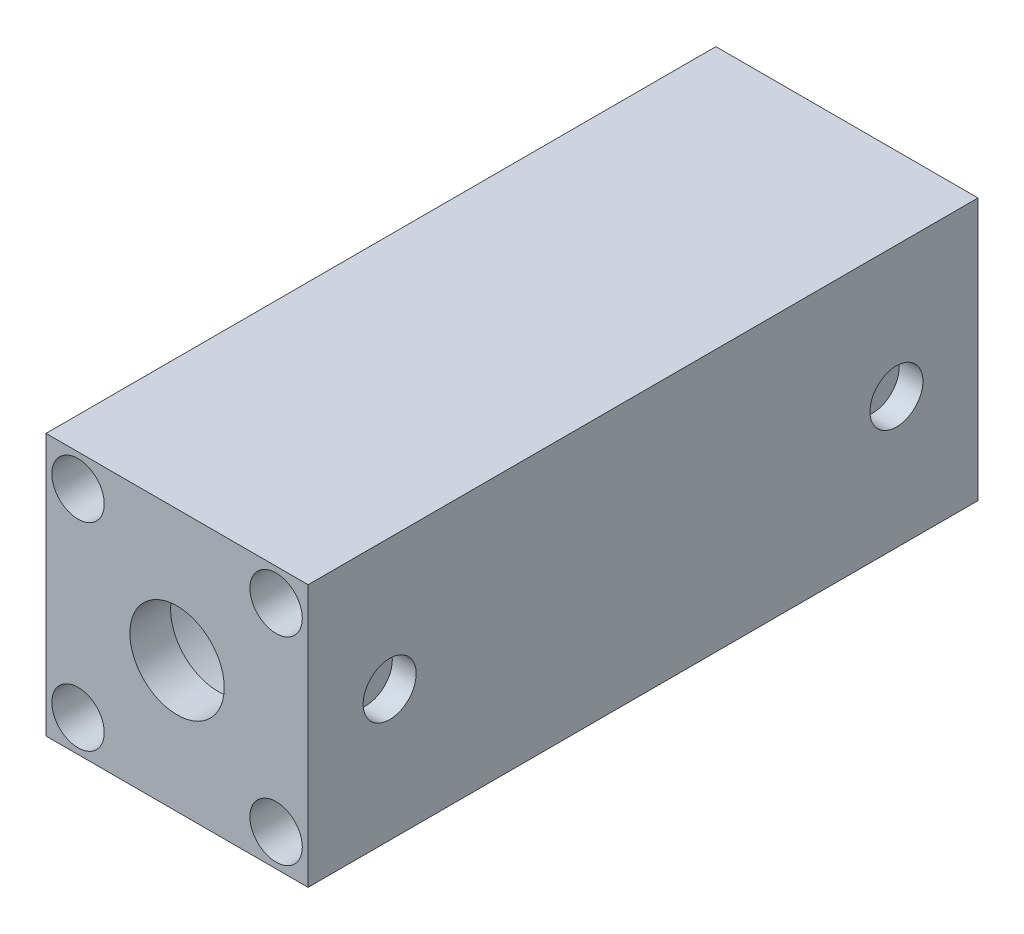
ISO-10303-21;
HEADER;
FILE_DESCRIPTION(('STEP AP214'),'2;1');
FILE_NAME('part.step','',(''),(''),'','','');
FILE_SCHEMA(('AUTOMOTIVE_DESIGN { 1 0 10303 214 1 1 1 1 }'));
ENDSEC;
DATA;
#1=APPLICATION_CONTEXT('core data for automotive mechanical design processes');
#2=APPLICATION_PROTOCOL_DEFINITION('international standard','automotive_design',2000,#1);
#3=PRODUCT_CONTEXT('',#1,'mechanical');
#4=PRODUCT('Part','Part','',(#3));
#5=PRODUCT_RELATED_PRODUCT_CATEGORY('part','',(#4));
#6=PRODUCT_DEFINITION_FORMATION('','',#4);
#7=PRODUCT_DEFINITION_CONTEXT('part definition',#1,'design');
#8=PRODUCT_DEFINITION('design','',#6,#7);
#9=PRODUCT_DEFINITION_SHAPE('','',#8);
#10=(LENGTH_UNIT() NAMED_UNIT(*) SI_UNIT(.MILLI.,.METRE.));
#11=(NAMED_UNIT(*) PLANE_ANGLE_UNIT() SI_UNIT($,.RADIAN.));
#12=(NAMED_UNIT(*) SI_UNIT($,.STERADIAN.) SOLID_ANGLE_UNIT());
#13=UNCERTAINTY_MEASURE_WITH_UNIT(LENGTH_MEASURE(1.E-05),#10,'distance_accuracy_value','');
#14=(GEOMETRIC_REPRESENTATION_CONTEXT(3) GLOBAL_UNCERTAINTY_ASSIGNED_CONTEXT((#13)) GLOBAL_UNIT_ASSIGNED_CONTEXT((#10,
#11,#12)) REPRESENTATION_CONTEXT('',''));
#15=CARTESIAN_POINT('',(0.,0.,0.));
#16=DIRECTION('',(0.,0.,1.));
#17=DIRECTION('',(1.,0.,0.));
#18=AXIS2_PLACEMENT_3D('',#15,#16,#17);
#19=CARTESIAN_POINT('',(-17.,-17.,115.));
#20=DIRECTION('',(0.,0.,-1.));
#21=DIRECTION('',(-1.,0.,0.));
#22=AXIS2_PLACEMENT_3D('',#19,#20,#21);
#23=CYLINDRICAL_SURFACE('',#22,2.75);
#24=CARTESIAN_POINT('',(-17.,-17.,7.00000000000001));
#25=DIRECTION('',(0.,0.,1.));
#26=DIRECTION('',(1.,0.,0.));
#27=AXIS2_PLACEMENT_3D('',#24,#25,#26);
#28=CIRCLE('',#27,2.75);
#29=CARTESIAN_POINT('',(-14.25,-17.,7.00000000000001));
#30=VERTEX_POINT('',#29);
#31=EDGE_CURVE('E133',#30,#30,#28,.T.);
#32=ORIENTED_EDGE('',*,*,#31,.F.);
#33=EDGE_LOOP('',(#32));
#34=FACE_BOUND('',#33,.T.);
#35=CARTESIAN_POINT('',(-17.,-17.,108.));
#36=DIRECTION('',(0.,0.,1.));
#37=DIRECTION('',(1.,0.,0.));
#38=AXIS2_PLACEMENT_3D('',#35,#36,#37);
#39=CIRCLE('',#38,2.75);
#40=CARTESIAN_POINT('',(-14.25,-17.,108.));
#41=VERTEX_POINT('',#40);
#42=EDGE_CURVE('E44',#41,#41,#39,.T.);
#43=ORIENTED_EDGE('',*,*,#42,.T.);
#44=EDGE_LOOP('',(#43));
#45=FACE_BOUND('',#44,.T.);
#46=ADVANCED_FACE('F41',(#34,#45),#23,.F.);
#47=CARTESIAN_POINT('',(-17.,17.,115.));
#48=DIRECTION('',(0.,0.,-1.));
#49=DIRECTION('',(-1.,0.,0.));
#50=AXIS2_PLACEMENT_3D('',#47,#48,#49);
#51=CYLINDRICAL_SURFACE('',#50,2.75);
#52=CARTESIAN_POINT('',(-17.,17.,7.00000000000001));
#53=DIRECTION('',(0.,0.,1.));
#54=DIRECTION('',(1.,0.,0.));
#55=AXIS2_PLACEMENT_3D('',#52,#53,#54);
#56=CIRCLE('',#55,2.75);
#57=CARTESIAN_POINT('',(-14.25,17.,7.00000000000001));
#58=VERTEX_POINT('',#57);
#59=EDGE_CURVE('E126',#58,#58,#56,.T.);
#60=ORIENTED_EDGE('',*,*,#59,.F.);
#61=EDGE_LOOP('',(#60));
#62=FACE_BOUND('',#61,.T.);
#63=CARTESIAN_POINT('',(-17.,17.,108.));
#64=DIRECTION('',(0.,0.,1.));
#65=DIRECTION('',(1.,0.,0.));
#66=AXIS2_PLACEMENT_3D('',#63,#64,#65);
#67=CIRCLE('',#66,2.75);
#68=CARTESIAN_POINT('',(-14.25,17.,108.));
#69=VERTEX_POINT('',#68);
#70=EDGE_CURVE('E143',#69,#69,#67,.T.);
#71=ORIENTED_EDGE('',*,*,#70,.T.);
#72=EDGE_LOOP('',(#71));
#73=FACE_BOUND('',#72,.T.);
#74=ADVANCED_FACE('F202',(#62,#73),#51,.F.);
#75=CARTESIAN_POINT('',(17.,-17.,115.));
#76=DIRECTION('',(0.,0.,-1.));
#77=DIRECTION('',(-1.,0.,0.));
#78=AXIS2_PLACEMENT_3D('',#75,#76,#77);
#79=CYLINDRICAL_SURFACE('',#78,2.75);
#80=CARTESIAN_POINT('',(17.,-17.,7.00000000000001));
#81=DIRECTION('',(0.,0.,1.));
#82=DIRECTION('',(1.,0.,0.));
#83=AXIS2_PLACEMENT_3D('',#80,#81,#82);
#84=CIRCLE('',#83,2.75);
#85=CARTESIAN_POINT('',(19.75,-17.,7.00000000000001));
#86=VERTEX_POINT('',#85);
#87=EDGE_CURVE('E123',#86,#86,#84,.T.);
#88=ORIENTED_EDGE('',*,*,#87,.F.);
#89=EDGE_LOOP('',(#88));
#90=FACE_BOUND('',#89,.T.);
#91=CARTESIAN_POINT('',(17.,-17.,108.));
#92=DIRECTION('',(0.,0.,1.));
#93=DIRECTION('',(1.,0.,0.));
#94=AXIS2_PLACEMENT_3D('',#91,#92,#93);
#95=CIRCLE('',#94,2.75);
#96=CARTESIAN_POINT('',(19.75,-17.,108.));
#97=VERTEX_POINT('',#96);
#98=EDGE_CURVE('E137',#97,#97,#95,.T.);
#99=ORIENTED_EDGE('',*,*,#98,.T.);
#100=EDGE_LOOP('',(#99));
#101=FACE_BOUND('',#100,.T.);
#102=ADVANCED_FACE('F215',(#90,#101),#79,.F.);
#103=CARTESIAN_POINT('',(17.,17.,115.));
#104=DIRECTION('',(0.,0.,-1.));
#105=DIRECTION('',(-1.,0.,0.));
#106=AXIS2_PLACEMENT_3D('',#103,#104,#105);
#107=CYLINDRICAL_SURFACE('',#106,2.75);
#108=CARTESIAN_POINT('',(17.,17.,7.00000000000001));
#109=DIRECTION('',(0.,0.,1.));
#110=DIRECTION('',(1.,0.,0.));
#111=AXIS2_PLACEMENT_3D('',#108,#109,#110);
#112=CIRCLE('',#111,2.75);
#113=CARTESIAN_POINT('',(19.75,17.,7.00000000000001));
#114=VERTEX_POINT('',#113);
#115=EDGE_CURVE('E121',#114,#114,#112,.T.);
#116=ORIENTED_EDGE('',*,*,#115,.F.);
#117=EDGE_LOOP('',(#116));
#118=FACE_BOUND('',#117,.T.);
#119=CARTESIAN_POINT('',(17.,17.,108.));
#120=DIRECTION('',(0.,0.,1.));
#121=DIRECTION('',(1.,0.,0.));
#122=AXIS2_PLACEMENT_3D('',#119,#120,#121);
#123=CIRCLE('',#122,2.75);
#124=CARTESIAN_POINT('',(19.75,17.,108.));
#125=VERTEX_POINT('',#124);
#126=EDGE_CURVE('E131',#125,#125,#123,.T.);
#127=ORIENTED_EDGE('',*,*,#126,.T.);
#128=EDGE_LOOP('',(#127));
#129=FACE_BOUND('',#128,.T.);
#130=ADVANCED_FACE('F222',(#118,#129),#107,.F.);
#131=CARTESIAN_POINT('',(0.,0.,115.));
#132=DIRECTION('',(0.,0.,1.));
#133=DIRECTION('',(1.,0.,0.));
#134=AXIS2_PLACEMENT_3D('',#131,#132,#133);
#135=PLANE('',#134);
#136=CARTESIAN_POINT('',(-17.,17.,115.));
#137=DIRECTION('',(0.,0.,1.));
#138=DIRECTION('',(1.,0.,0.));
#139=AXIS2_PLACEMENT_3D('',#136,#137,#138);
#140=CIRCLE('',#139,4.5);
#141=CARTESIAN_POINT('',(-12.5,17.,115.));
#142=VERTEX_POINT('',#141);
#143=EDGE_CURVE('E542',#142,#142,#140,.T.);
#144=ORIENTED_EDGE('',*,*,#143,.F.);
#145=EDGE_LOOP('',(#144));
#146=FACE_BOUND('',#145,.T.);
#147=CARTESIAN_POINT('',(17.,-17.,115.));
#148=DIRECTION('',(0.,0.,1.));
#149=DIRECTION('',(1.,0.,0.));
#150=AXIS2_PLACEMENT_3D('',#147,#148,#149);
#151=CIRCLE('',#150,4.5);
#152=CARTESIAN_POINT('',(21.5,-17.,115.));
#153=VERTEX_POINT('',#152);
#154=EDGE_CURVE('E538',#153,#153,#151,.T.);
#155=ORIENTED_EDGE('',*,*,#154,.F.);
#156=EDGE_LOOP('',(#155));
#157=FACE_BOUND('',#156,.T.);
#158=CARTESIAN_POINT('',(17.,17.,115.));
#159=DIRECTION('',(0.,0.,1.));
#160=DIRECTION('',(1.,0.,0.));
#161=AXIS2_PLACEMENT_3D('',#158,#159,#160);
#162=CIRCLE('',#161,4.5);
#163=CARTESIAN_POINT('',(21.5,17.,115.));
#164=VERTEX_POINT('',#163);
#165=EDGE_CURVE('E525',#164,#164,#162,.T.);
#166=ORIENTED_EDGE('',*,*,#165,.F.);
#167=EDGE_LOOP('',(#166));
#168=FACE_BOUND('',#167,.T.);
#169=CARTESIAN_POINT('',(-17.,-17.,115.));
#170=DIRECTION('',(0.,0.,1.));
#171=DIRECTION('',(1.,0.,0.));
#172=AXIS2_PLACEMENT_3D('',#169,#170,#171);
#173=CIRCLE('',#172,4.5);
#174=CARTESIAN_POINT('',(-12.5,-17.,115.));
#175=VERTEX_POINT('',#174);
#176=EDGE_CURVE('E138',#175,#175,#173,.T.);
#177=ORIENTED_EDGE('',*,*,#176,.F.);
#178=EDGE_LOOP('',(#177));
#179=FACE_BOUND('',#178,.T.);
#180=DIRECTION('',(0.,-1.,0.));
#181=VECTOR('',#180,1.);
#182=CARTESIAN_POINT('',(-22.5,22.5,115.));
#183=LINE('',#182,#181);
#184=CARTESIAN_POINT('',(-22.5,22.5,115.));
#185=VERTEX_POINT('',#184);
#186=CARTESIAN_POINT('',(-22.5,-22.5,115.));
#187=VERTEX_POINT('',#186);
#188=EDGE_CURVE('E100',#185,#187,#183,.T.);
#189=ORIENTED_EDGE('',*,*,#188,.T.);
#190=DIRECTION('',(1.,0.,0.));
#191=VECTOR('',#190,1.);
#192=CARTESIAN_POINT('',(-22.5,-22.5,115.));
#193=LINE('',#192,#191);
#194=CARTESIAN_POINT('',(22.5,-22.5,115.));
#195=VERTEX_POINT('',#194);
#196=EDGE_CURVE('E93',#187,#195,#193,.T.);
#197=ORIENTED_EDGE('',*,*,#196,.T.);
#198=DIRECTION('',(0.,1.,0.));
#199=VECTOR('',#198,1.);
#200=CARTESIAN_POINT('',(22.5,-22.5,115.));
#201=LINE('',#200,#199);
#202=CARTESIAN_POINT('',(22.5,22.5,115.));
#203=VERTEX_POINT('',#202);
#204=EDGE_CURVE('E92',#195,#203,#201,.T.);
#205=ORIENTED_EDGE('',*,*,#204,.T.);
#206=DIRECTION('',(-1.,0.,0.));
#207=VECTOR('',#206,1.);
#208=CARTESIAN_POINT('',(22.5,22.5,115.));
#209=LINE('',#208,#207);
#210=EDGE_CURVE('E58',#203,#185,#209,.T.);
#211=ORIENTED_EDGE('',*,*,#210,.T.);
#212=EDGE_LOOP('',(#189,#197,#205,#211));
#213=FACE_BOUND('',#212,.T.);
#214=CARTESIAN_POINT('',(0.,0.,115.));
#215=DIRECTION('',(0.,0.,1.));
#216=DIRECTION('',(1.,0.,0.));
#217=AXIS2_PLACEMENT_3D('',#214,#215,#216);
#218=CIRCLE('',#217,8.1);
#219=CARTESIAN_POINT('',(8.1,0.,115.));
#220=VERTEX_POINT('',#219);
#221=EDGE_CURVE('E171',#220,#220,#218,.T.);
#222=ORIENTED_EDGE('',*,*,#221,.F.);
#223=EDGE_LOOP('',(#222));
#224=FACE_BOUND('',#223,.T.);
#225=ADVANCED_FACE('F95',(#146,#157,#168,#179,#213,#224),#135,.T.);
#226=CARTESIAN_POINT('',(0.,0.,0.));
#227=DIRECTION('',(0.,0.,1.));
#228=DIRECTION('',(1.,0.,0.));
#229=AXIS2_PLACEMENT_3D('',#226,#227,#228);
#230=PLANE('',#229);
#231=CARTESIAN_POINT('',(-17.,17.,0.));
#232=DIRECTION('',(0.,0.,1.));
#233=DIRECTION('',(1.,0.,0.));
#234=AXIS2_PLACEMENT_3D('',#231,#232,#233);
#235=CIRCLE('',#234,4.5);
#236=CARTESIAN_POINT('',(-12.5,17.,0.));
#237=VERTEX_POINT('',#236);
#238=EDGE_CURVE('E157',#237,#237,#235,.T.);
#239=ORIENTED_EDGE('',*,*,#238,.T.);
#240=EDGE_LOOP('',(#239));
#241=FACE_BOUND('',#240,.T.);
#242=CARTESIAN_POINT('',(17.,-17.,0.));
#243=DIRECTION('',(0.,0.,1.));
#244=DIRECTION('',(1.,0.,0.));
#245=AXIS2_PLACEMENT_3D('',#242,#243,#244);
#246=CIRCLE('',#245,4.5);
#247=CARTESIAN_POINT('',(21.5,-17.,0.));
#248=VERTEX_POINT('',#247);
#249=EDGE_CURVE('E167',#248,#248,#246,.T.);
#250=ORIENTED_EDGE('',*,*,#249,.T.);
#251=EDGE_LOOP('',(#250));
#252=FACE_BOUND('',#251,.T.);
#253=CARTESIAN_POINT('',(17.,17.,0.));
#254=DIRECTION('',(0.,0.,1.));
#255=DIRECTION('',(1.,0.,0.));
#256=AXIS2_PLACEMENT_3D('',#253,#254,#255);
#257=CIRCLE('',#256,4.5);
#258=CARTESIAN_POINT('',(21.5,17.,0.));
#259=VERTEX_POINT('',#258);
#260=EDGE_CURVE('E147',#259,#259,#257,.T.);
#261=ORIENTED_EDGE('',*,*,#260,.T.);
#262=EDGE_LOOP('',(#261));
#263=FACE_BOUND('',#262,.T.);
#264=CARTESIAN_POINT('',(-17.,-17.,0.));
#265=DIRECTION('',(0.,0.,1.));
#266=DIRECTION('',(1.,0.,0.));
#267=AXIS2_PLACEMENT_3D('',#264,#265,#266);
#268=CIRCLE('',#267,4.5);
#269=CARTESIAN_POINT('',(-12.5,-17.,0.));
#270=VERTEX_POINT('',#269);
#271=EDGE_CURVE('E165',#270,#270,#268,.T.);
#272=ORIENTED_EDGE('',*,*,#271,.T.);
#273=EDGE_LOOP('',(#272));
#274=FACE_BOUND('',#273,.T.);
#275=DIRECTION('',(0.,-1.,0.));
#276=VECTOR('',#275,1.);
#277=CARTESIAN_POINT('',(-22.5,22.5,0.));
#278=LINE('',#277,#276);
#279=CARTESIAN_POINT('',(-22.5,22.5,0.));
#280=VERTEX_POINT('',#279);
#281=CARTESIAN_POINT('',(-22.5,-22.5,0.));
#282=VERTEX_POINT('',#281);
#283=EDGE_CURVE('E112',#280,#282,#278,.T.);
#284=ORIENTED_EDGE('',*,*,#283,.F.);
#285=DIRECTION('',(-1.,0.,0.));
#286=VECTOR('',#285,1.);
#287=CARTESIAN_POINT('',(22.5,22.5,0.));
#288=LINE('',#287,#286);
#289=CARTESIAN_POINT('',(22.5,22.5,0.));
#290=VERTEX_POINT('',#289);
#291=EDGE_CURVE('E82',#290,#280,#288,.T.);
#292=ORIENTED_EDGE('',*,*,#291,.F.);
#293=DIRECTION('',(0.,1.,0.));
#294=VECTOR('',#293,1.);
#295=CARTESIAN_POINT('',(22.5,-22.5,0.));
#296=LINE('',#295,#294);
#297=CARTESIAN_POINT('',(22.5,-22.5,0.));
#298=VERTEX_POINT('',#297);
#299=EDGE_CURVE('E79',#298,#290,#296,.T.);
#300=ORIENTED_EDGE('',*,*,#299,.F.);
#301=DIRECTION('',(1.,0.,0.));
#302=VECTOR('',#301,1.);
#303=CARTESIAN_POINT('',(-22.5,-22.5,0.));
#304=LINE('',#303,#302);
#305=EDGE_CURVE('E105',#282,#298,#304,.T.);
#306=ORIENTED_EDGE('',*,*,#305,.F.);
#307=EDGE_LOOP('',(#284,#292,#300,#306));
#308=FACE_BOUND('',#307,.T.);
#309=ADVANCED_FACE('F219',(#241,#252,#263,#274,#308),#230,.F.);
#310=CARTESIAN_POINT('',(-22.5,22.5,115.));
#311=DIRECTION('',(1.,0.,0.));
#312=DIRECTION('',(0.,0.,-1.));
#313=AXIS2_PLACEMENT_3D('',#310,#311,#312);
#314=PLANE('',#313);
#315=ORIENTED_EDGE('',*,*,#283,.T.);
#316=DIRECTION('',(0.,0.,-1.));
#317=VECTOR('',#316,1.);
#318=CARTESIAN_POINT('',(-22.5,-22.5,115.));
#319=LINE('',#318,#317);
#320=EDGE_CURVE('E51',#187,#282,#319,.T.);
#321=ORIENTED_EDGE('',*,*,#320,.F.);
#322=ORIENTED_EDGE('',*,*,#188,.F.);
#323=DIRECTION('',(0.,0.,-1.));
#324=VECTOR('',#323,1.);
#325=CARTESIAN_POINT('',(-22.5,22.5,115.));
#326=LINE('',#325,#324);
#327=EDGE_CURVE('E110',#185,#280,#326,.T.);
#328=ORIENTED_EDGE('',*,*,#327,.T.);
#329=EDGE_LOOP('',(#315,#321,#322,#328));
#330=FACE_BOUND('',#329,.T.);
#331=ADVANCED_FACE('F43',(#330),#314,.F.);
#332=CARTESIAN_POINT('',(-22.5,-22.5,115.));
#333=DIRECTION('',(0.,1.,0.));
#334=DIRECTION('',(0.,0.,1.));
#335=AXIS2_PLACEMENT_3D('',#332,#333,#334);
#336=PLANE('',#335);
#337=ORIENTED_EDGE('',*,*,#305,.T.);
#338=DIRECTION('',(0.,0.,-1.));
#339=VECTOR('',#338,1.);
#340=CARTESIAN_POINT('',(22.5,-22.5,115.));
#341=LINE('',#340,#339);
#342=EDGE_CURVE('E99',#195,#298,#341,.T.);
#343=ORIENTED_EDGE('',*,*,#342,.F.);
#344=ORIENTED_EDGE('',*,*,#196,.F.);
#345=ORIENTED_EDGE('',*,*,#320,.T.);
#346=EDGE_LOOP('',(#337,#343,#344,#345));
#347=FACE_BOUND('',#346,.T.);
#348=ADVANCED_FACE('F101',(#347),#336,.F.);
#349=CARTESIAN_POINT('',(22.5,-22.5,115.));
#350=DIRECTION('',(-1.,0.,0.));
#351=DIRECTION('',(0.,0.,1.));
#352=AXIS2_PLACEMENT_3D('',#349,#350,#351);
#353=PLANE('',#352);
#354=CARTESIAN_POINT('',(22.5,0.,14.));
#355=DIRECTION('',(1.,0.,0.));
#356=DIRECTION('',(0.,0.,-1.));
#357=AXIS2_PLACEMENT_3D('',#354,#355,#356);
#358=CIRCLE('',#357,4.55);
#359=CARTESIAN_POINT('',(22.5,0.,9.45));
#360=VERTEX_POINT('',#359);
#361=EDGE_CURVE('E522',#360,#360,#358,.T.);
#362=ORIENTED_EDGE('',*,*,#361,.F.);
#363=EDGE_LOOP('',(#362));
#364=FACE_BOUND('',#363,.T.);
#365=CARTESIAN_POINT('',(22.5,0.,101.));
#366=DIRECTION('',(1.,0.,0.));
#367=DIRECTION('',(0.,0.,-1.));
#368=AXIS2_PLACEMENT_3D('',#365,#366,#367);
#369=CIRCLE('',#368,4.55);
#370=CARTESIAN_POINT('',(22.5,0.,96.45));
#371=VERTEX_POINT('',#370);
#372=EDGE_CURVE('E530',#371,#371,#369,.T.);
#373=ORIENTED_EDGE('',*,*,#372,.F.);
#374=EDGE_LOOP('',(#373));
#375=FACE_BOUND('',#374,.T.);
#376=ORIENTED_EDGE('',*,*,#299,.T.);
#377=DIRECTION('',(0.,0.,-1.));
#378=VECTOR('',#377,1.);
#379=CARTESIAN_POINT('',(22.5,22.5,115.));
#380=LINE('',#379,#378);
#381=EDGE_CURVE('E103',#203,#290,#380,.T.);
#382=ORIENTED_EDGE('',*,*,#381,.F.);
#383=ORIENTED_EDGE('',*,*,#204,.F.);
#384=ORIENTED_EDGE('',*,*,#342,.T.);
#385=EDGE_LOOP('',(#376,#382,#383,#384));
#386=FACE_BOUND('',#385,.T.);
#387=ADVANCED_FACE('F104',(#364,#375,#386),#353,.F.);
#388=CARTESIAN_POINT('',(22.5,22.5,115.));
#389=DIRECTION('',(0.,-1.,0.));
#390=DIRECTION('',(0.,0.,-1.));
#391=AXIS2_PLACEMENT_3D('',#388,#389,#390);
#392=PLANE('',#391);
#393=ORIENTED_EDGE('',*,*,#291,.T.);
#394=ORIENTED_EDGE('',*,*,#327,.F.);
#395=ORIENTED_EDGE('',*,*,#210,.F.);
#396=ORIENTED_EDGE('',*,*,#381,.T.);
#397=EDGE_LOOP('',(#393,#394,#395,#396));
#398=FACE_BOUND('',#397,.T.);
#399=ADVANCED_FACE('F190',(#398),#392,.F.);
#400=CARTESIAN_POINT('',(0.,0.,108.));
#401=DIRECTION('',(0.,0.,1.));
#402=DIRECTION('',(1.,0.,0.));
#403=AXIS2_PLACEMENT_3D('',#400,#401,#402);
#404=PLANE('',#403);
#405=CARTESIAN_POINT('',(0.,0.,108.));
#406=DIRECTION('',(0.,0.,1.));
#407=DIRECTION('',(1.,0.,0.));
#408=AXIS2_PLACEMENT_3D('',#405,#406,#407);
#409=CIRCLE('',#408,16.);
#410=CARTESIAN_POINT('',(16.,0.,108.));
#411=VERTEX_POINT('',#410);
#412=EDGE_CURVE('E111',#411,#411,#409,.T.);
#413=ORIENTED_EDGE('',*,*,#412,.F.);
#414=EDGE_LOOP('',(#413));
#415=FACE_BOUND('',#414,.T.);
#416=CARTESIAN_POINT('',(0.,0.,108.));
#417=DIRECTION('',(0.,0.,1.));
#418=DIRECTION('',(1.,0.,0.));
#419=AXIS2_PLACEMENT_3D('',#416,#417,#418);
#420=CIRCLE('',#419,8.1);
#421=CARTESIAN_POINT('',(8.1,0.,108.));
#422=VERTEX_POINT('',#421);
#423=EDGE_CURVE('E135',#422,#422,#420,.T.);
#424=ORIENTED_EDGE('',*,*,#423,.T.);
#425=EDGE_LOOP('',(#424));
#426=FACE_BOUND('',#425,.T.);
#427=ADVANCED_FACE('F183',(#415,#426),#404,.F.);
#428=CARTESIAN_POINT('',(0.,0.,115.));
#429=DIRECTION('',(0.,0.,-1.));
#430=DIRECTION('',(-1.,0.,0.));
#431=AXIS2_PLACEMENT_3D('',#428,#429,#430);
#432=CYLINDRICAL_SURFACE('',#431,8.1);
#433=ORIENTED_EDGE('',*,*,#221,.T.);
#434=EDGE_LOOP('',(#433));
#435=FACE_BOUND('',#434,.T.);
#436=ORIENTED_EDGE('',*,*,#423,.F.);
#437=EDGE_LOOP('',(#436));
#438=FACE_BOUND('',#437,.T.);
#439=ADVANCED_FACE('F187',(#435,#438),#432,.F.);
#440=CARTESIAN_POINT('',(0.,0.,7.));
#441=DIRECTION('',(0.,0.,1.));
#442=DIRECTION('',(1.,0.,0.));
#443=AXIS2_PLACEMENT_3D('',#440,#441,#442);
#444=PLANE('',#443);
#445=CARTESIAN_POINT('',(0.,0.,7.00000000000001));
#446=DIRECTION('',(0.,0.,1.));
#447=DIRECTION('',(1.,0.,0.));
#448=AXIS2_PLACEMENT_3D('',#445,#446,#447);
#449=CIRCLE('',#448,16.);
#450=CARTESIAN_POINT('',(16.,0.,7.00000000000001));
#451=VERTEX_POINT('',#450);
#452=EDGE_CURVE('E11',#451,#451,#449,.T.);
#453=ORIENTED_EDGE('',*,*,#452,.T.);
#454=EDGE_LOOP('',(#453));
#455=FACE_BOUND('',#454,.T.);
#456=ADVANCED_FACE('F193',(#455),#444,.T.);
#457=CARTESIAN_POINT('',(0.,0.,115.));
#458=DIRECTION('',(0.,0.,-1.));
#459=DIRECTION('',(-1.,0.,0.));
#460=AXIS2_PLACEMENT_3D('',#457,#458,#459);
#461=CYLINDRICAL_SURFACE('',#460,16.);
#462=ORIENTED_EDGE('',*,*,#452,.F.);
#463=EDGE_LOOP('',(#462));
#464=FACE_BOUND('',#463,.T.);
#465=ORIENTED_EDGE('',*,*,#412,.T.);
#466=EDGE_LOOP('',(#465));
#467=FACE_BOUND('',#466,.T.);
#468=ADVANCED_FACE('F181',(#464,#467),#461,.F.);
#469=CARTESIAN_POINT('',(17.,17.,7.));
#470=DIRECTION('',(0.,0.,-1.));
#471=DIRECTION('',(-1.,0.,0.));
#472=AXIS2_PLACEMENT_3D('',#469,#470,#471);
#473=CYLINDRICAL_SURFACE('',#472,4.5);
#474=CARTESIAN_POINT('',(17.,17.,7.));
#475=DIRECTION('',(0.,0.,1.));
#476=DIRECTION('',(1.,0.,0.));
#477=AXIS2_PLACEMENT_3D('',#474,#475,#476);
#478=CIRCLE('',#477,4.5);
#479=CARTESIAN_POINT('',(21.5,17.,7.));
#480=VERTEX_POINT('',#479);
#481=EDGE_CURVE('E148',#480,#480,#478,.T.);
#482=ORIENTED_EDGE('',*,*,#481,.T.);
#483=EDGE_LOOP('',(#482));
#484=FACE_BOUND('',#483,.T.);
#485=ORIENTED_EDGE('',*,*,#260,.F.);
#486=EDGE_LOOP('',(#485));
#487=FACE_BOUND('',#486,.T.);
#488=ADVANCED_FACE('F284',(#484,#487),#473,.F.);
#489=CARTESIAN_POINT('',(17.,17.,7.));
#490=DIRECTION('',(0.,0.,1.));
#491=DIRECTION('',(1.,0.,0.));
#492=AXIS2_PLACEMENT_3D('',#489,#490,#491);
#493=PLANE('',#492);
#494=ORIENTED_EDGE('',*,*,#115,.T.);
#495=EDGE_LOOP('',(#494));
#496=FACE_BOUND('',#495,.T.);
#497=ORIENTED_EDGE('',*,*,#481,.F.);
#498=EDGE_LOOP('',(#497));
#499=FACE_BOUND('',#498,.T.);
#500=ADVANCED_FACE('F310',(#496,#499),#493,.F.);
#501=CARTESIAN_POINT('',(17.,-17.,7.));
#502=DIRECTION('',(0.,0.,-1.));
#503=DIRECTION('',(-1.,0.,0.));
#504=AXIS2_PLACEMENT_3D('',#501,#502,#503);
#505=CYLINDRICAL_SURFACE('',#504,4.5);
#506=CARTESIAN_POINT('',(17.,-17.,7.));
#507=DIRECTION('',(0.,0.,1.));
#508=DIRECTION('',(1.,0.,0.));
#509=AXIS2_PLACEMENT_3D('',#506,#507,#508);
#510=CIRCLE('',#509,4.5);
#511=CARTESIAN_POINT('',(21.5,-17.,7.));
#512=VERTEX_POINT('',#511);
#513=EDGE_CURVE('E154',#512,#512,#510,.T.);
#514=ORIENTED_EDGE('',*,*,#513,.T.);
#515=EDGE_LOOP('',(#514));
#516=FACE_BOUND('',#515,.T.);
#517=ORIENTED_EDGE('',*,*,#249,.F.);
#518=EDGE_LOOP('',(#517));
#519=FACE_BOUND('',#518,.T.);
#520=ADVANCED_FACE('F318',(#516,#519),#505,.F.);
#521=CARTESIAN_POINT('',(17.,-17.,7.));
#522=DIRECTION('',(0.,0.,1.));
#523=DIRECTION('',(1.,0.,0.));
#524=AXIS2_PLACEMENT_3D('',#521,#522,#523);
#525=PLANE('',#524);
#526=ORIENTED_EDGE('',*,*,#87,.T.);
#527=EDGE_LOOP('',(#526));
#528=FACE_BOUND('',#527,.T.);
#529=ORIENTED_EDGE('',*,*,#513,.F.);
#530=EDGE_LOOP('',(#529));
#531=FACE_BOUND('',#530,.T.);
#532=ADVANCED_FACE('F327',(#528,#531),#525,.F.);
#533=CARTESIAN_POINT('',(-17.,17.,7.));
#534=DIRECTION('',(0.,0.,-1.));
#535=DIRECTION('',(-1.,0.,0.));
#536=AXIS2_PLACEMENT_3D('',#533,#534,#535);
#537=CYLINDRICAL_SURFACE('',#536,4.5);
#538=CARTESIAN_POINT('',(-17.,17.,7.));
#539=DIRECTION('',(0.,0.,1.));
#540=DIRECTION('',(1.,0.,0.));
#541=AXIS2_PLACEMENT_3D('',#538,#539,#540);
#542=CIRCLE('',#541,4.5);
#543=CARTESIAN_POINT('',(-12.5,17.,7.));
#544=VERTEX_POINT('',#543);
#545=EDGE_CURVE('E162',#544,#544,#542,.T.);
#546=ORIENTED_EDGE('',*,*,#545,.T.);
#547=EDGE_LOOP('',(#546));
#548=FACE_BOUND('',#547,.T.);
#549=ORIENTED_EDGE('',*,*,#238,.F.);
#550=EDGE_LOOP('',(#549));
#551=FACE_BOUND('',#550,.T.);
#552=ADVANCED_FACE('F337',(#548,#551),#537,.F.);
#553=CARTESIAN_POINT('',(-17.,17.,7.));
#554=DIRECTION('',(0.,0.,1.));
#555=DIRECTION('',(1.,0.,0.));
#556=AXIS2_PLACEMENT_3D('',#553,#554,#555);
#557=PLANE('',#556);
#558=ORIENTED_EDGE('',*,*,#59,.T.);
#559=EDGE_LOOP('',(#558));
#560=FACE_BOUND('',#559,.T.);
#561=ORIENTED_EDGE('',*,*,#545,.F.);
#562=EDGE_LOOP('',(#561));
#563=FACE_BOUND('',#562,.T.);
#564=ADVANCED_FACE('F346',(#560,#563),#557,.F.);
#565=CARTESIAN_POINT('',(-17.,-17.,7.));
#566=DIRECTION('',(0.,0.,-1.));
#567=DIRECTION('',(-1.,0.,0.));
#568=AXIS2_PLACEMENT_3D('',#565,#566,#567);
#569=CYLINDRICAL_SURFACE('',#568,4.5);
#570=CARTESIAN_POINT('',(-17.,-17.,7.));
#571=DIRECTION('',(0.,0.,1.));
#572=DIRECTION('',(1.,0.,0.));
#573=AXIS2_PLACEMENT_3D('',#570,#571,#572);
#574=CIRCLE('',#573,4.5);
#575=CARTESIAN_POINT('',(-12.5,-17.,7.));
#576=VERTEX_POINT('',#575);
#577=EDGE_CURVE('E124',#576,#576,#574,.T.);
#578=ORIENTED_EDGE('',*,*,#577,.T.);
#579=EDGE_LOOP('',(#578));
#580=FACE_BOUND('',#579,.T.);
#581=ORIENTED_EDGE('',*,*,#271,.F.);
#582=EDGE_LOOP('',(#581));
#583=FACE_BOUND('',#582,.T.);
#584=ADVANCED_FACE('F357',(#580,#583),#569,.F.);
#585=CARTESIAN_POINT('',(-17.,-17.,7.));
#586=DIRECTION('',(0.,0.,1.));
#587=DIRECTION('',(1.,0.,0.));
#588=AXIS2_PLACEMENT_3D('',#585,#586,#587);
#589=PLANE('',#588);
#590=ORIENTED_EDGE('',*,*,#31,.T.);
#591=EDGE_LOOP('',(#590));
#592=FACE_BOUND('',#591,.T.);
#593=ORIENTED_EDGE('',*,*,#577,.F.);
#594=EDGE_LOOP('',(#593));
#595=FACE_BOUND('',#594,.T.);
#596=ADVANCED_FACE('F366',(#592,#595),#589,.F.);
#597=CARTESIAN_POINT('',(17.,17.,115.));
#598=DIRECTION('',(0.,0.,-1.));
#599=DIRECTION('',(-1.,0.,0.));
#600=AXIS2_PLACEMENT_3D('',#597,#598,#599);
#601=CYLINDRICAL_SURFACE('',#600,4.5);
#602=ORIENTED_EDGE('',*,*,#165,.T.);
#603=EDGE_LOOP('',(#602));
#604=FACE_BOUND('',#603,.T.);
#605=CARTESIAN_POINT('',(17.,17.,108.));
#606=DIRECTION('',(0.,0.,1.));
#607=DIRECTION('',(1.,0.,0.));
#608=AXIS2_PLACEMENT_3D('',#605,#606,#607);
#609=CIRCLE('',#608,4.5);
#610=CARTESIAN_POINT('',(21.5,17.,108.));
#611=VERTEX_POINT('',#610);
#612=EDGE_CURVE('E528',#611,#611,#609,.T.);
#613=ORIENTED_EDGE('',*,*,#612,.F.);
#614=EDGE_LOOP('',(#613));
#615=FACE_BOUND('',#614,.T.);
#616=ADVANCED_FACE('F376',(#604,#615),#601,.F.);
#617=CARTESIAN_POINT('',(17.,17.,108.));
#618=DIRECTION('',(0.,0.,1.));
#619=DIRECTION('',(1.,0.,0.));
#620=AXIS2_PLACEMENT_3D('',#617,#618,#619);
#621=PLANE('',#620);
#622=ORIENTED_EDGE('',*,*,#126,.F.);
#623=EDGE_LOOP('',(#622));
#624=FACE_BOUND('',#623,.T.);
#625=ORIENTED_EDGE('',*,*,#612,.T.);
#626=EDGE_LOOP('',(#625));
#627=FACE_BOUND('',#626,.T.);
#628=ADVANCED_FACE('F407',(#624,#627),#621,.T.);
#629=CARTESIAN_POINT('',(17.,-17.,115.));
#630=DIRECTION('',(0.,0.,-1.));
#631=DIRECTION('',(-1.,0.,0.));
#632=AXIS2_PLACEMENT_3D('',#629,#630,#631);
#633=CYLINDRICAL_SURFACE('',#632,4.5);
#634=ORIENTED_EDGE('',*,*,#154,.T.);
#635=EDGE_LOOP('',(#634));
#636=FACE_BOUND('',#635,.T.);
#637=CARTESIAN_POINT('',(17.,-17.,108.));
#638=DIRECTION('',(0.,0.,1.));
#639=DIRECTION('',(1.,0.,0.));
#640=AXIS2_PLACEMENT_3D('',#637,#638,#639);
#641=CIRCLE('',#640,4.5);
#642=CARTESIAN_POINT('',(21.5,-17.,108.));
#643=VERTEX_POINT('',#642);
#644=EDGE_CURVE('E550',#643,#643,#641,.T.);
#645=ORIENTED_EDGE('',*,*,#644,.F.);
#646=EDGE_LOOP('',(#645));
#647=FACE_BOUND('',#646,.T.);
#648=ADVANCED_FACE('F416',(#636,#647),#633,.F.);
#649=CARTESIAN_POINT('',(17.,-17.,108.));
#650=DIRECTION('',(0.,0.,1.));
#651=DIRECTION('',(1.,0.,0.));
#652=AXIS2_PLACEMENT_3D('',#649,#650,#651);
#653=PLANE('',#652);
#654=ORIENTED_EDGE('',*,*,#98,.F.);
#655=EDGE_LOOP('',(#654));
#656=FACE_BOUND('',#655,.T.);
#657=ORIENTED_EDGE('',*,*,#644,.T.);
#658=EDGE_LOOP('',(#657));
#659=FACE_BOUND('',#658,.T.);
#660=ADVANCED_FACE('F428',(#656,#659),#653,.T.);
#661=CARTESIAN_POINT('',(-17.,17.,115.));
#662=DIRECTION('',(0.,0.,-1.));
#663=DIRECTION('',(-1.,0.,0.));
#664=AXIS2_PLACEMENT_3D('',#661,#662,#663);
#665=CYLINDRICAL_SURFACE('',#664,4.5);
#666=ORIENTED_EDGE('',*,*,#143,.T.);
#667=EDGE_LOOP('',(#666));
#668=FACE_BOUND('',#667,.T.);
#669=CARTESIAN_POINT('',(-17.,17.,108.));
#670=DIRECTION('',(0.,0.,1.));
#671=DIRECTION('',(1.,0.,0.));
#672=AXIS2_PLACEMENT_3D('',#669,#670,#671);
#673=CIRCLE('',#672,4.5);
#674=CARTESIAN_POINT('',(-12.5,17.,108.));
#675=VERTEX_POINT('',#674);
#676=EDGE_CURVE('E539',#675,#675,#673,.T.);
#677=ORIENTED_EDGE('',*,*,#676,.F.);
#678=EDGE_LOOP('',(#677));
#679=FACE_BOUND('',#678,.T.);
#680=ADVANCED_FACE('F437',(#668,#679),#665,.F.);
#681=CARTESIAN_POINT('',(-17.,17.,108.));
#682=DIRECTION('',(0.,0.,1.));
#683=DIRECTION('',(1.,0.,0.));
#684=AXIS2_PLACEMENT_3D('',#681,#682,#683);
#685=PLANE('',#684);
#686=ORIENTED_EDGE('',*,*,#70,.F.);
#687=EDGE_LOOP('',(#686));
#688=FACE_BOUND('',#687,.T.);
#689=ORIENTED_EDGE('',*,*,#676,.T.);
#690=EDGE_LOOP('',(#689));
#691=FACE_BOUND('',#690,.T.);
#692=ADVANCED_FACE('F447',(#688,#691),#685,.T.);
#693=CARTESIAN_POINT('',(-17.,-17.,115.));
#694=DIRECTION('',(0.,0.,-1.));
#695=DIRECTION('',(-1.,0.,0.));
#696=AXIS2_PLACEMENT_3D('',#693,#694,#695);
#697=CYLINDRICAL_SURFACE('',#696,4.5);
#698=ORIENTED_EDGE('',*,*,#176,.T.);
#699=EDGE_LOOP('',(#698));
#700=FACE_BOUND('',#699,.T.);
#701=CARTESIAN_POINT('',(-17.,-17.,108.));
#702=DIRECTION('',(0.,0.,1.));
#703=DIRECTION('',(1.,0.,0.));
#704=AXIS2_PLACEMENT_3D('',#701,#702,#703);
#705=CIRCLE('',#704,4.5);
#706=CARTESIAN_POINT('',(-12.5,-17.,108.));
#707=VERTEX_POINT('',#706);
#708=EDGE_CURVE('E543',#707,#707,#705,.T.);
#709=ORIENTED_EDGE('',*,*,#708,.F.);
#710=EDGE_LOOP('',(#709));
#711=FACE_BOUND('',#710,.T.);
#712=ADVANCED_FACE('F456',(#700,#711),#697,.F.);
#713=CARTESIAN_POINT('',(-17.,-17.,108.));
#714=DIRECTION('',(0.,0.,1.));
#715=DIRECTION('',(1.,0.,0.));
#716=AXIS2_PLACEMENT_3D('',#713,#714,#715);
#717=PLANE('',#716);
#718=ORIENTED_EDGE('',*,*,#42,.F.);
#719=EDGE_LOOP('',(#718));
#720=FACE_BOUND('',#719,.T.);
#721=ORIENTED_EDGE('',*,*,#708,.T.);
#722=EDGE_LOOP('',(#721));
#723=FACE_BOUND('',#722,.T.);
#724=ADVANCED_FACE('F467',(#720,#723),#717,.T.);
#725=CARTESIAN_POINT('',(18.4,0.,101.));
#726=DIRECTION('',(1.,0.,0.));
#727=DIRECTION('',(0.,0.,-1.));
#728=AXIS2_PLACEMENT_3D('',#725,#726,#727);
#729=CYLINDRICAL_SURFACE('',#728,4.55);
#730=CARTESIAN_POINT('',(18.4,0.,101.));
#731=DIRECTION('',(1.,0.,0.));
#732=DIRECTION('',(0.,0.,-1.));
#733=AXIS2_PLACEMENT_3D('',#730,#731,#732);
#734=CIRCLE('',#733,4.55);
#735=CARTESIAN_POINT('',(18.4,0.,96.45));
#736=VERTEX_POINT('',#735);
#737=EDGE_CURVE('E534',#736,#736,#734,.T.);
#738=ORIENTED_EDGE('',*,*,#737,.F.);
#739=EDGE_LOOP('',(#738));
#740=FACE_BOUND('',#739,.T.);
#741=ORIENTED_EDGE('',*,*,#372,.T.);
#742=EDGE_LOOP('',(#741));
#743=FACE_BOUND('',#742,.T.);
#744=ADVANCED_FACE('F480',(#740,#743),#729,.F.);
#745=CARTESIAN_POINT('',(18.4,0.,101.));
#746=DIRECTION('',(1.,0.,0.));
#747=DIRECTION('',(0.,0.,-1.));
#748=AXIS2_PLACEMENT_3D('',#745,#746,#747);
#749=PLANE('',#748);
#750=ORIENTED_EDGE('',*,*,#737,.T.);
#751=EDGE_LOOP('',(#750));
#752=FACE_BOUND('',#751,.T.);
#753=ADVANCED_FACE('F486',(#752),#749,.T.);
#754=CARTESIAN_POINT('',(18.4,0.,14.));
#755=DIRECTION('',(1.,0.,0.));
#756=DIRECTION('',(0.,0.,-1.));
#757=AXIS2_PLACEMENT_3D('',#754,#755,#756);
#758=CYLINDRICAL_SURFACE('',#757,4.55);
#759=CARTESIAN_POINT('',(18.4,0.,14.));
#760=DIRECTION('',(1.,0.,0.));
#761=DIRECTION('',(0.,0.,-1.));
#762=AXIS2_PLACEMENT_3D('',#759,#760,#761);
#763=CIRCLE('',#762,4.55);
#764=CARTESIAN_POINT('',(18.4,0.,9.45));
#765=VERTEX_POINT('',#764);
#766=EDGE_CURVE('E521',#765,#765,#763,.T.);
#767=ORIENTED_EDGE('',*,*,#766,.F.);
#768=EDGE_LOOP('',(#767));
#769=FACE_BOUND('',#768,.T.);
#770=ORIENTED_EDGE('',*,*,#361,.T.);
#771=EDGE_LOOP('',(#770));
#772=FACE_BOUND('',#771,.T.);
#773=ADVANCED_FACE('F497',(#769,#772),#758,.F.);
#774=CARTESIAN_POINT('',(18.4,0.,14.));
#775=DIRECTION('',(1.,0.,0.));
#776=DIRECTION('',(0.,0.,-1.));
#777=AXIS2_PLACEMENT_3D('',#774,#775,#776);
#778=PLANE('',#777);
#779=ORIENTED_EDGE('',*,*,#766,.T.);
#780=EDGE_LOOP('',(#779));
#781=FACE_BOUND('',#780,.T.);
#782=ADVANCED_FACE('F506',(#781),#778,.T.);
#783=CLOSED_SHELL('',(#46,#74,#102,#130,#225,#309,#331,#348,#387,#399,#427,#439,#456,#468,#488,
#500,#520,#532,#552,#564,#584,#596,#616,#628,#648,#660,#680,#692,#712,#724,#744,#753,#773,#782));
#784=MANIFOLD_SOLID_BREP('B2',#783);
#785=ADVANCED_BREP_SHAPE_REPRESENTATION('',(#18,#784),#14);
#786=SHAPE_DEFINITION_REPRESENTATION(#9,#785);
ENDSEC;
END-ISO-10303-21;
